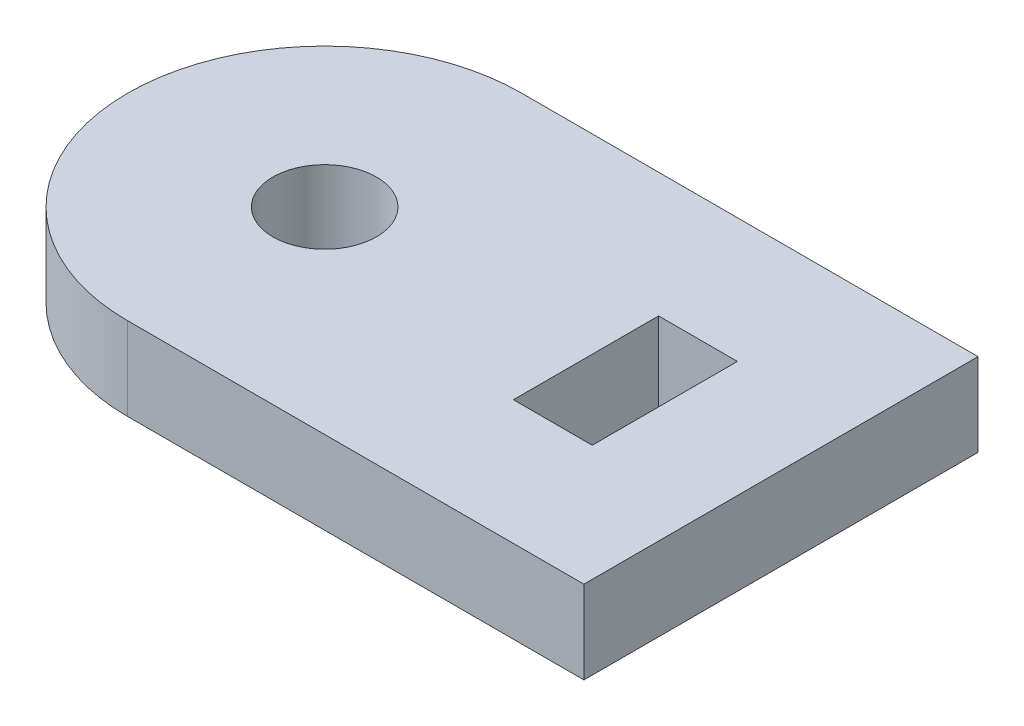
ISO-10303-21;
HEADER;
FILE_DESCRIPTION(('STEP AP214'),'2;1');
FILE_NAME('part.step','',(''),(''),'','','');
FILE_SCHEMA(('AUTOMOTIVE_DESIGN { 1 0 10303 214 1 1 1 1 }'));
ENDSEC;
DATA;
#1=APPLICATION_CONTEXT('core data for automotive mechanical design processes');
#2=APPLICATION_PROTOCOL_DEFINITION('international standard','automotive_design',2000,#1);
#3=PRODUCT_CONTEXT('',#1,'mechanical');
#4=PRODUCT('Part','Part','',(#3));
#5=PRODUCT_RELATED_PRODUCT_CATEGORY('part','',(#4));
#6=PRODUCT_DEFINITION_FORMATION('','',#4);
#7=PRODUCT_DEFINITION_CONTEXT('part definition',#1,'design');
#8=PRODUCT_DEFINITION('design','',#6,#7);
#9=PRODUCT_DEFINITION_SHAPE('','',#8);
#10=(LENGTH_UNIT() NAMED_UNIT(*) SI_UNIT(.MILLI.,.METRE.));
#11=(NAMED_UNIT(*) PLANE_ANGLE_UNIT() SI_UNIT($,.RADIAN.));
#12=(NAMED_UNIT(*) SI_UNIT($,.STERADIAN.) SOLID_ANGLE_UNIT());
#13=UNCERTAINTY_MEASURE_WITH_UNIT(LENGTH_MEASURE(1.E-05),#10,'distance_accuracy_value','');
#14=(GEOMETRIC_REPRESENTATION_CONTEXT(3) GLOBAL_UNCERTAINTY_ASSIGNED_CONTEXT((#13)) GLOBAL_UNIT_ASSIGNED_CONTEXT((#10,
#11,#12)) REPRESENTATION_CONTEXT('',''));
#15=CARTESIAN_POINT('',(0.,0.,0.));
#16=DIRECTION('',(0.,0.,1.));
#17=DIRECTION('',(1.,0.,0.));
#18=AXIS2_PLACEMENT_3D('',#15,#16,#17);
#19=CARTESIAN_POINT('',(12.6,4.,0.));
#20=DIRECTION('',(1.,0.,0.));
#21=DIRECTION('',(0.,0.,-1.));
#22=AXIS2_PLACEMENT_3D('',#19,#20,#21);
#23=PLANE('',#22);
#24=DIRECTION('',(0.,0.,1.));
#25=VECTOR('',#24,1.);
#26=CARTESIAN_POINT('',(12.6,0.,0.));
#27=LINE('',#26,#25);
#28=CARTESIAN_POINT('',(12.6,0.,-13.));
#29=VERTEX_POINT('',#28);
#30=CARTESIAN_POINT('',(12.6,0.,-6.));
#31=VERTEX_POINT('',#30);
#32=EDGE_CURVE('E151',#29,#31,#27,.T.);
#33=ORIENTED_EDGE('',*,*,#32,.F.);
#34=DIRECTION('',(0.,-1.,0.));
#35=VECTOR('',#34,1.);
#36=CARTESIAN_POINT('',(12.6,4.,-13.));
#37=LINE('',#36,#35);
#38=CARTESIAN_POINT('',(12.6,4.,-13.));
#39=VERTEX_POINT('',#38);
#40=EDGE_CURVE('E11',#39,#29,#37,.T.);
#41=ORIENTED_EDGE('',*,*,#40,.F.);
#42=DIRECTION('',(0.,0.,1.));
#43=VECTOR('',#42,1.);
#44=CARTESIAN_POINT('',(12.6,4.,0.));
#45=LINE('',#44,#43);
#46=CARTESIAN_POINT('',(12.6,4.,-6.));
#47=VERTEX_POINT('',#46);
#48=EDGE_CURVE('E128',#39,#47,#45,.T.);
#49=ORIENTED_EDGE('',*,*,#48,.T.);
#50=DIRECTION('',(0.,-1.,0.));
#51=VECTOR('',#50,1.);
#52=CARTESIAN_POINT('',(12.6,4.,-6.));
#53=LINE('',#52,#51);
#54=EDGE_CURVE('E90',#47,#31,#53,.T.);
#55=ORIENTED_EDGE('',*,*,#54,.T.);
#56=EDGE_LOOP('',(#33,#41,#49,#55));
#57=FACE_BOUND('',#56,.T.);
#58=ADVANCED_FACE('F36',(#57),#23,.T.);
#59=CARTESIAN_POINT('',(0.,4.,-13.));
#60=DIRECTION('',(0.,0.,1.));
#61=DIRECTION('',(1.,0.,0.));
#62=AXIS2_PLACEMENT_3D('',#59,#60,#61);
#63=PLANE('',#62);
#64=DIRECTION('',(-1.,0.,0.));
#65=VECTOR('',#64,1.);
#66=CARTESIAN_POINT('',(0.,0.,-13.));
#67=LINE('',#66,#65);
#68=CARTESIAN_POINT('',(16.4,0.,-13.));
#69=VERTEX_POINT('',#68);
#70=EDGE_CURVE('E118',#69,#29,#67,.T.);
#71=ORIENTED_EDGE('',*,*,#70,.F.);
#72=DIRECTION('',(0.,-1.,0.));
#73=VECTOR('',#72,1.);
#74=CARTESIAN_POINT('',(16.4,4.,-13.));
#75=LINE('',#74,#73);
#76=CARTESIAN_POINT('',(16.4,4.,-13.));
#77=VERTEX_POINT('',#76);
#78=EDGE_CURVE('E46',#77,#69,#75,.T.);
#79=ORIENTED_EDGE('',*,*,#78,.F.);
#80=DIRECTION('',(-1.,0.,0.));
#81=VECTOR('',#80,1.);
#82=CARTESIAN_POINT('',(0.,4.,-13.));
#83=LINE('',#82,#81);
#84=EDGE_CURVE('E116',#77,#39,#83,.T.);
#85=ORIENTED_EDGE('',*,*,#84,.T.);
#86=ORIENTED_EDGE('',*,*,#40,.T.);
#87=EDGE_LOOP('',(#71,#79,#85,#86));
#88=FACE_BOUND('',#87,.T.);
#89=ADVANCED_FACE('F114',(#88),#63,.T.);
#90=CARTESIAN_POINT('',(16.4,4.,0.));
#91=DIRECTION('',(1.,0.,0.));
#92=DIRECTION('',(0.,0.,-1.));
#93=AXIS2_PLACEMENT_3D('',#90,#91,#92);
#94=PLANE('',#93);
#95=DIRECTION('',(0.,0.,1.));
#96=VECTOR('',#95,1.);
#97=CARTESIAN_POINT('',(16.4,0.,0.));
#98=LINE('',#97,#96);
#99=CARTESIAN_POINT('',(16.4,0.,-6.));
#100=VERTEX_POINT('',#99);
#101=EDGE_CURVE('E154',#69,#100,#98,.T.);
#102=ORIENTED_EDGE('',*,*,#101,.T.);
#103=DIRECTION('',(0.,-1.,0.));
#104=VECTOR('',#103,1.);
#105=CARTESIAN_POINT('',(16.4,4.,-6.));
#106=LINE('',#105,#104);
#107=CARTESIAN_POINT('',(16.4,4.,-6.));
#108=VERTEX_POINT('',#107);
#109=EDGE_CURVE('E121',#108,#100,#106,.T.);
#110=ORIENTED_EDGE('',*,*,#109,.F.);
#111=DIRECTION('',(0.,0.,1.));
#112=VECTOR('',#111,1.);
#113=CARTESIAN_POINT('',(16.4,4.,0.));
#114=LINE('',#113,#112);
#115=EDGE_CURVE('E124',#77,#108,#114,.T.);
#116=ORIENTED_EDGE('',*,*,#115,.F.);
#117=ORIENTED_EDGE('',*,*,#78,.T.);
#118=EDGE_LOOP('',(#102,#110,#116,#117));
#119=FACE_BOUND('',#118,.T.);
#120=ADVANCED_FACE('F125',(#119),#94,.F.);
#121=CARTESIAN_POINT('',(0.,4.,-9.5));
#122=DIRECTION('',(0.,-1.,0.));
#123=DIRECTION('',(0.,0.,-1.));
#124=AXIS2_PLACEMENT_3D('',#121,#122,#123);
#125=CYLINDRICAL_SURFACE('',#124,9.5);
#126=CARTESIAN_POINT('',(0.,0.,-9.5));
#127=DIRECTION('',(0.,1.,0.));
#128=DIRECTION('',(0.,0.,1.));
#129=AXIS2_PLACEMENT_3D('',#126,#127,#128);
#130=CIRCLE('',#129,9.5);
#131=CARTESIAN_POINT('',(0.,0.,0.));
#132=VERTEX_POINT('',#131);
#133=CARTESIAN_POINT('',(0.,0.,-19.));
#134=VERTEX_POINT('',#133);
#135=EDGE_CURVE('E139',#132,#134,#130,.F.);
#136=ORIENTED_EDGE('',*,*,#135,.F.);
#137=DIRECTION('',(0.,-1.,0.));
#138=VECTOR('',#137,1.);
#139=CARTESIAN_POINT('',(0.,4.,0.));
#140=LINE('',#139,#138);
#141=CARTESIAN_POINT('',(0.,4.,0.));
#142=VERTEX_POINT('',#141);
#143=EDGE_CURVE('E40',#142,#132,#140,.T.);
#144=ORIENTED_EDGE('',*,*,#143,.F.);
#145=CARTESIAN_POINT('',(0.,4.,-9.5));
#146=DIRECTION('',(0.,1.,0.));
#147=DIRECTION('',(0.,0.,1.));
#148=AXIS2_PLACEMENT_3D('',#145,#146,#147);
#149=CIRCLE('',#148,9.5);
#150=CARTESIAN_POINT('',(0.,4.,-19.));
#151=VERTEX_POINT('',#150);
#152=EDGE_CURVE('E177',#142,#151,#149,.F.);
#153=ORIENTED_EDGE('',*,*,#152,.T.);
#154=DIRECTION('',(0.,-1.,0.));
#155=VECTOR('',#154,1.);
#156=CARTESIAN_POINT('',(0.,4.,-19.));
#157=LINE('',#156,#155);
#158=EDGE_CURVE('E135',#151,#134,#157,.T.);
#159=ORIENTED_EDGE('',*,*,#158,.T.);
#160=EDGE_LOOP('',(#136,#144,#153,#159));
#161=FACE_BOUND('',#160,.T.);
#162=ADVANCED_FACE('F175',(#161),#125,.T.);
#163=CARTESIAN_POINT('',(0.,4.,0.));
#164=DIRECTION('',(0.,0.,-1.));
#165=DIRECTION('',(-1.,0.,0.));
#166=AXIS2_PLACEMENT_3D('',#163,#164,#165);
#167=PLANE('',#166);
#168=DIRECTION('',(1.,0.,0.));
#169=VECTOR('',#168,1.);
#170=CARTESIAN_POINT('',(0.,0.,0.));
#171=LINE('',#170,#169);
#172=CARTESIAN_POINT('',(22.,0.,0.));
#173=VERTEX_POINT('',#172);
#174=EDGE_CURVE('E142',#132,#173,#171,.T.);
#175=ORIENTED_EDGE('',*,*,#174,.T.);
#176=DIRECTION('',(0.,-1.,0.));
#177=VECTOR('',#176,1.);
#178=CARTESIAN_POINT('',(22.,4.,0.));
#179=LINE('',#178,#177);
#180=CARTESIAN_POINT('',(22.,4.,0.));
#181=VERTEX_POINT('',#180);
#182=EDGE_CURVE('E163',#181,#173,#179,.T.);
#183=ORIENTED_EDGE('',*,*,#182,.F.);
#184=DIRECTION('',(1.,0.,0.));
#185=VECTOR('',#184,1.);
#186=CARTESIAN_POINT('',(0.,4.,0.));
#187=LINE('',#186,#185);
#188=EDGE_CURVE('E171',#142,#181,#187,.T.);
#189=ORIENTED_EDGE('',*,*,#188,.F.);
#190=ORIENTED_EDGE('',*,*,#143,.T.);
#191=EDGE_LOOP('',(#175,#183,#189,#190));
#192=FACE_BOUND('',#191,.T.);
#193=ADVANCED_FACE('F169',(#192),#167,.F.);
#194=CARTESIAN_POINT('',(22.,4.,0.));
#195=DIRECTION('',(-1.,0.,0.));
#196=DIRECTION('',(0.,0.,1.));
#197=AXIS2_PLACEMENT_3D('',#194,#195,#196);
#198=PLANE('',#197);
#199=DIRECTION('',(0.,0.,-1.));
#200=VECTOR('',#199,1.);
#201=CARTESIAN_POINT('',(22.,0.,0.));
#202=LINE('',#201,#200);
#203=CARTESIAN_POINT('',(22.,0.,-19.));
#204=VERTEX_POINT('',#203);
#205=EDGE_CURVE('E145',#173,#204,#202,.T.);
#206=ORIENTED_EDGE('',*,*,#205,.T.);
#207=DIRECTION('',(0.,-1.,0.));
#208=VECTOR('',#207,1.);
#209=CARTESIAN_POINT('',(22.,4.,-19.));
#210=LINE('',#209,#208);
#211=CARTESIAN_POINT('',(22.,4.,-19.));
#212=VERTEX_POINT('',#211);
#213=EDGE_CURVE('E161',#212,#204,#210,.T.);
#214=ORIENTED_EDGE('',*,*,#213,.F.);
#215=DIRECTION('',(0.,0.,-1.));
#216=VECTOR('',#215,1.);
#217=CARTESIAN_POINT('',(22.,4.,0.));
#218=LINE('',#217,#216);
#219=EDGE_CURVE('E215',#181,#212,#218,.T.);
#220=ORIENTED_EDGE('',*,*,#219,.F.);
#221=ORIENTED_EDGE('',*,*,#182,.T.);
#222=EDGE_LOOP('',(#206,#214,#220,#221));
#223=FACE_BOUND('',#222,.T.);
#224=ADVANCED_FACE('F182',(#223),#198,.F.);
#225=CARTESIAN_POINT('',(0.,4.,-19.));
#226=DIRECTION('',(0.,0.,1.));
#227=DIRECTION('',(1.,0.,0.));
#228=AXIS2_PLACEMENT_3D('',#225,#226,#227);
#229=PLANE('',#228);
#230=DIRECTION('',(-1.,0.,0.));
#231=VECTOR('',#230,1.);
#232=CARTESIAN_POINT('',(0.,0.,-19.));
#233=LINE('',#232,#231);
#234=EDGE_CURVE('E148',#204,#134,#233,.T.);
#235=ORIENTED_EDGE('',*,*,#234,.T.);
#236=ORIENTED_EDGE('',*,*,#158,.F.);
#237=DIRECTION('',(-1.,0.,0.));
#238=VECTOR('',#237,1.);
#239=CARTESIAN_POINT('',(0.,4.,-19.));
#240=LINE('',#239,#238);
#241=EDGE_CURVE('E130',#212,#151,#240,.T.);
#242=ORIENTED_EDGE('',*,*,#241,.F.);
#243=ORIENTED_EDGE('',*,*,#213,.T.);
#244=EDGE_LOOP('',(#235,#236,#242,#243));
#245=FACE_BOUND('',#244,.T.);
#246=ADVANCED_FACE('F179',(#245),#229,.F.);
#247=CARTESIAN_POINT('',(0.,4.,-9.5));
#248=DIRECTION('',(0.,-1.,0.));
#249=DIRECTION('',(0.,0.,-1.));
#250=AXIS2_PLACEMENT_3D('',#247,#248,#249);
#251=CYLINDRICAL_SURFACE('',#250,2.5);
#252=CARTESIAN_POINT('',(0.,4.,-9.5));
#253=DIRECTION('',(0.,1.,0.));
#254=DIRECTION('',(0.,0.,1.));
#255=AXIS2_PLACEMENT_3D('',#252,#253,#254);
#256=CIRCLE('',#255,2.5);
#257=CARTESIAN_POINT('',(0.,4.,-7.));
#258=VERTEX_POINT('',#257);
#259=EDGE_CURVE('E157',#258,#258,#256,.T.);
#260=ORIENTED_EDGE('',*,*,#259,.T.);
#261=EDGE_LOOP('',(#260));
#262=FACE_BOUND('',#261,.T.);
#263=CARTESIAN_POINT('',(0.,0.,-9.5));
#264=DIRECTION('',(0.,1.,0.));
#265=DIRECTION('',(0.,0.,1.));
#266=AXIS2_PLACEMENT_3D('',#263,#264,#265);
#267=CIRCLE('',#266,2.5);
#268=CARTESIAN_POINT('',(0.,0.,-7.));
#269=VERTEX_POINT('',#268);
#270=EDGE_CURVE('E136',#269,#269,#267,.T.);
#271=ORIENTED_EDGE('',*,*,#270,.F.);
#272=EDGE_LOOP('',(#271));
#273=FACE_BOUND('',#272,.T.);
#274=ADVANCED_FACE('F38',(#262,#273),#251,.F.);
#275=CARTESIAN_POINT('',(0.,4.,-6.));
#276=DIRECTION('',(0.,0.,1.));
#277=DIRECTION('',(1.,0.,0.));
#278=AXIS2_PLACEMENT_3D('',#275,#276,#277);
#279=PLANE('',#278);
#280=DIRECTION('',(-1.,0.,0.));
#281=VECTOR('',#280,1.);
#282=CARTESIAN_POINT('',(0.,0.,-6.));
#283=LINE('',#282,#281);
#284=EDGE_CURVE('E83',#100,#31,#283,.T.);
#285=ORIENTED_EDGE('',*,*,#284,.T.);
#286=ORIENTED_EDGE('',*,*,#54,.F.);
#287=DIRECTION('',(-1.,0.,0.));
#288=VECTOR('',#287,1.);
#289=CARTESIAN_POINT('',(0.,4.,-6.));
#290=LINE('',#289,#288);
#291=EDGE_CURVE('E55',#108,#47,#290,.T.);
#292=ORIENTED_EDGE('',*,*,#291,.F.);
#293=ORIENTED_EDGE('',*,*,#109,.T.);
#294=EDGE_LOOP('',(#285,#286,#292,#293));
#295=FACE_BOUND('',#294,.T.);
#296=ADVANCED_FACE('F200',(#295),#279,.F.);
#297=CARTESIAN_POINT('',(0.,4.,0.));
#298=DIRECTION('',(0.,1.,0.));
#299=DIRECTION('',(0.,0.,1.));
#300=AXIS2_PLACEMENT_3D('',#297,#298,#299);
#301=PLANE('',#300);
#302=ORIENTED_EDGE('',*,*,#259,.F.);
#303=EDGE_LOOP('',(#302));
#304=FACE_BOUND('',#303,.T.);
#305=ORIENTED_EDGE('',*,*,#152,.F.);
#306=ORIENTED_EDGE('',*,*,#188,.T.);
#307=ORIENTED_EDGE('',*,*,#219,.T.);
#308=ORIENTED_EDGE('',*,*,#241,.T.);
#309=EDGE_LOOP('',(#305,#306,#307,#308));
#310=FACE_BOUND('',#309,.T.);
#311=ORIENTED_EDGE('',*,*,#48,.F.);
#312=ORIENTED_EDGE('',*,*,#84,.F.);
#313=ORIENTED_EDGE('',*,*,#115,.T.);
#314=ORIENTED_EDGE('',*,*,#291,.T.);
#315=EDGE_LOOP('',(#311,#312,#313,#314));
#316=FACE_BOUND('',#315,.T.);
#317=ADVANCED_FACE('F127',(#304,#310,#316),#301,.T.);
#318=CARTESIAN_POINT('',(0.,0.,0.));
#319=DIRECTION('',(0.,1.,0.));
#320=DIRECTION('',(0.,0.,1.));
#321=AXIS2_PLACEMENT_3D('',#318,#319,#320);
#322=PLANE('',#321);
#323=ORIENTED_EDGE('',*,*,#270,.T.);
#324=EDGE_LOOP('',(#323));
#325=FACE_BOUND('',#324,.T.);
#326=ORIENTED_EDGE('',*,*,#135,.T.);
#327=ORIENTED_EDGE('',*,*,#234,.F.);
#328=ORIENTED_EDGE('',*,*,#205,.F.);
#329=ORIENTED_EDGE('',*,*,#174,.F.);
#330=EDGE_LOOP('',(#326,#327,#328,#329));
#331=FACE_BOUND('',#330,.T.);
#332=ORIENTED_EDGE('',*,*,#32,.T.);
#333=ORIENTED_EDGE('',*,*,#284,.F.);
#334=ORIENTED_EDGE('',*,*,#101,.F.);
#335=ORIENTED_EDGE('',*,*,#70,.T.);
#336=EDGE_LOOP('',(#332,#333,#334,#335));
#337=FACE_BOUND('',#336,.T.);
#338=ADVANCED_FACE('F174',(#325,#331,#337),#322,.F.);
#339=CLOSED_SHELL('',(#58,#89,#120,#162,#193,#224,#246,#274,#296,#317,#338));
#340=MANIFOLD_SOLID_BREP('B2',#339);
#341=ADVANCED_BREP_SHAPE_REPRESENTATION('',(#18,#340),#14);
#342=SHAPE_DEFINITION_REPRESENTATION(#9,#341);
ENDSEC;
END-ISO-10303-21;
